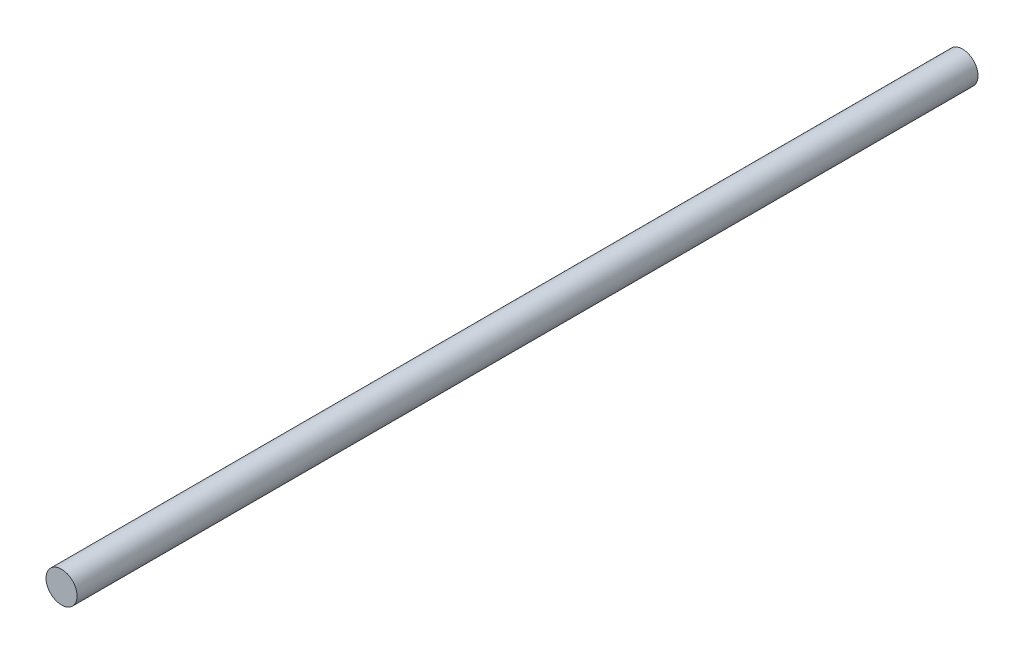
ISO-10303-21;
HEADER;
FILE_DESCRIPTION(('STEP AP214'),'2;1');
FILE_NAME('part.step','',(''),(''),'','','');
FILE_SCHEMA(('AUTOMOTIVE_DESIGN { 1 0 10303 214 1 1 1 1 }'));
ENDSEC;
DATA;
#1=APPLICATION_CONTEXT('core data for automotive mechanical design processes');
#2=APPLICATION_PROTOCOL_DEFINITION('international standard','automotive_design',2000,#1);
#3=PRODUCT_CONTEXT('',#1,'mechanical');
#4=PRODUCT('Part','Part','',(#3));
#5=PRODUCT_RELATED_PRODUCT_CATEGORY('part','',(#4));
#6=PRODUCT_DEFINITION_FORMATION('','',#4);
#7=PRODUCT_DEFINITION_CONTEXT('part definition',#1,'design');
#8=PRODUCT_DEFINITION('design','',#6,#7);
#9=PRODUCT_DEFINITION_SHAPE('','',#8);
#10=(LENGTH_UNIT() NAMED_UNIT(*) SI_UNIT(.MILLI.,.METRE.));
#11=(NAMED_UNIT(*) PLANE_ANGLE_UNIT() SI_UNIT($,.RADIAN.));
#12=(NAMED_UNIT(*) SI_UNIT($,.STERADIAN.) SOLID_ANGLE_UNIT());
#13=UNCERTAINTY_MEASURE_WITH_UNIT(LENGTH_MEASURE(1.E-05),#10,'distance_accuracy_value','');
#14=(GEOMETRIC_REPRESENTATION_CONTEXT(3) GLOBAL_UNCERTAINTY_ASSIGNED_CONTEXT((#13)) GLOBAL_UNIT_ASSIGNED_CONTEXT((#10,
#11,#12)) REPRESENTATION_CONTEXT('',''));
#15=CARTESIAN_POINT('',(0.,0.,0.));
#16=DIRECTION('',(0.,0.,1.));
#17=DIRECTION('',(1.,0.,0.));
#18=AXIS2_PLACEMENT_3D('',#15,#16,#17);
#19=CARTESIAN_POINT('',(0.,0.,58.));
#20=DIRECTION('',(0.,0.,-1.));
#21=DIRECTION('',(-1.,0.,0.));
#22=AXIS2_PLACEMENT_3D('',#19,#20,#21);
#23=CYLINDRICAL_SURFACE('',#22,1.);
#24=CARTESIAN_POINT('',(0.,0.,58.));
#25=DIRECTION('',(0.,0.,1.));
#26=DIRECTION('',(1.,0.,0.));
#27=AXIS2_PLACEMENT_3D('',#24,#25,#26);
#28=CIRCLE('',#27,1.);
#29=CARTESIAN_POINT('',(-1.,0.,58.));
#30=VERTEX_POINT('',#29);
#31=EDGE_CURVE('E10',#30,#30,#28,.T.);
#32=CARTESIAN_POINT('',(0.,0.,0.));
#33=DIRECTION('',(0.,0.,1.));
#34=DIRECTION('',(1.,0.,0.));
#35=AXIS2_PLACEMENT_3D('',#32,#33,#34);
#36=CIRCLE('',#35,1.);
#37=CARTESIAN_POINT('',(-1.,0.,0.));
#38=VERTEX_POINT('',#37);
#39=EDGE_CURVE('E34',#38,#38,#36,.T.);
#40=CARTESIAN_POINT('',(-1.,0.,58.));
#41=CARTESIAN_POINT('',(-1.,0.,57.3958333333333));
#42=CARTESIAN_POINT('',(-1.,0.,56.7916666666667));
#43=CARTESIAN_POINT('',(-1.,0.,55.5833333333333));
#44=CARTESIAN_POINT('',(-1.,0.,54.9791666666667));
#45=CARTESIAN_POINT('',(-1.,0.,53.7708333333333));
#46=CARTESIAN_POINT('',(-1.,0.,53.1666666666667));
#47=CARTESIAN_POINT('',(-1.,0.,51.9583333333333));
#48=CARTESIAN_POINT('',(-1.,0.,51.3541666666667));
#49=CARTESIAN_POINT('',(-1.,0.,50.1458333333333));
#50=CARTESIAN_POINT('',(-1.,0.,49.5416666666667));
#51=CARTESIAN_POINT('',(-1.,0.,48.3333333333333));
#52=CARTESIAN_POINT('',(-1.,0.,47.7291666666667));
#53=CARTESIAN_POINT('',(-1.,0.,46.5208333333333));
#54=CARTESIAN_POINT('',(-1.,0.,45.9166666666667));
#55=CARTESIAN_POINT('',(-1.,0.,44.7083333333333));
#56=CARTESIAN_POINT('',(-1.,0.,44.1041666666667));
#57=CARTESIAN_POINT('',(-1.,0.,42.8958333333333));
#58=CARTESIAN_POINT('',(-1.,0.,42.2916666666667));
#59=CARTESIAN_POINT('',(-1.,0.,41.0833333333333));
#60=CARTESIAN_POINT('',(-1.,0.,40.4791666666667));
#61=CARTESIAN_POINT('',(-1.,0.,39.2708333333333));
#62=CARTESIAN_POINT('',(-1.,0.,38.6666666666667));
#63=CARTESIAN_POINT('',(-1.,0.,37.4583333333333));
#64=CARTESIAN_POINT('',(-1.,0.,36.8541666666667));
#65=CARTESIAN_POINT('',(-1.,0.,35.6458333333333));
#66=CARTESIAN_POINT('',(-1.,0.,35.0416666666667));
#67=CARTESIAN_POINT('',(-1.,0.,33.8333333333333));
#68=CARTESIAN_POINT('',(-1.,0.,33.2291666666667));
#69=CARTESIAN_POINT('',(-1.,0.,32.0208333333333));
#70=CARTESIAN_POINT('',(-1.,0.,31.4166666666667));
#71=CARTESIAN_POINT('',(-1.,0.,30.2083333333333));
#72=CARTESIAN_POINT('',(-1.,0.,29.6041666666667));
#73=CARTESIAN_POINT('',(-1.,0.,28.3958333333333));
#74=CARTESIAN_POINT('',(-1.,0.,27.7916666666667));
#75=CARTESIAN_POINT('',(-1.,0.,26.5833333333333));
#76=CARTESIAN_POINT('',(-1.,0.,25.9791666666667));
#77=CARTESIAN_POINT('',(-1.,0.,24.7708333333333));
#78=CARTESIAN_POINT('',(-1.,0.,24.1666666666667));
#79=CARTESIAN_POINT('',(-1.,0.,22.9583333333333));
#80=CARTESIAN_POINT('',(-1.,0.,22.3541666666667));
#81=CARTESIAN_POINT('',(-1.,0.,21.1458333333333));
#82=CARTESIAN_POINT('',(-1.,0.,20.5416666666667));
#83=CARTESIAN_POINT('',(-1.,0.,19.3333333333333));
#84=CARTESIAN_POINT('',(-1.,0.,18.7291666666667));
#85=CARTESIAN_POINT('',(-1.,0.,17.5208333333333));
#86=CARTESIAN_POINT('',(-1.,0.,16.9166666666667));
#87=CARTESIAN_POINT('',(-1.,0.,15.7083333333333));
#88=CARTESIAN_POINT('',(-1.,0.,15.1041666666667));
#89=CARTESIAN_POINT('',(-1.,0.,13.8958333333333));
#90=CARTESIAN_POINT('',(-1.,0.,13.2916666666667));
#91=CARTESIAN_POINT('',(-1.,0.,12.0833333333333));
#92=CARTESIAN_POINT('',(-1.,0.,11.4791666666667));
#93=CARTESIAN_POINT('',(-1.,0.,10.2708333333333));
#94=CARTESIAN_POINT('',(-1.,0.,9.66666666666667));
#95=CARTESIAN_POINT('',(-1.,0.,8.45833333333333));
#96=CARTESIAN_POINT('',(-1.,0.,7.85416666666667));
#97=CARTESIAN_POINT('',(-1.,0.,6.64583333333333));
#98=CARTESIAN_POINT('',(-1.,0.,6.04166666666667));
#99=CARTESIAN_POINT('',(-1.,0.,4.83333333333333));
#100=CARTESIAN_POINT('',(-1.,0.,4.22916666666667));
#101=CARTESIAN_POINT('',(-1.,0.,3.02083333333334));
#102=CARTESIAN_POINT('',(-1.,0.,2.41666666666667));
#103=CARTESIAN_POINT('',(-1.,0.,1.20833333333333));
#104=CARTESIAN_POINT('',(-1.,0.,0.604166666666666));
#105=CARTESIAN_POINT('',(-1.,0.,0.));
#106=B_SPLINE_CURVE_WITH_KNOTS('',3,(#40,#41,#42,#43,#44,#45,#46,#47,#48,#49,#50,#51,#52,#53,
#54,#55,#56,#57,#58,#59,#60,#61,#62,#63,#64,#65,#66,#67,#68,#69,#70,#71,#72,#73,#74,#75,#76,#77,
#78,#79,#80,#81,#82,#83,#84,#85,#86,#87,#88,#89,#90,#91,#92,#93,#94,#95,#96,#97,#98,#99,#100,
#101,#102,#103,#104,#105),.UNSPECIFIED.,.F.,.F.,(4,2,2,2,2,2,2,2,2,2,2,2,2,2,2,2,2,2,2,2,2,2,2,
2,2,2,2,2,2,2,2,2,4),(0.,1.8125,3.625,5.4375,7.25000000000001,9.0625,10.875,12.6875,14.5,
16.3125,18.125,19.9375,21.75,23.5625,25.375,27.1875,29.,30.8125,32.625,34.4375,36.25,38.0625,
39.875,41.6875,43.5,45.3125,47.125,48.9375,50.75,52.5625,54.375,56.1875,58.),.UNSPECIFIED.);
#107=EDGE_CURVE('BSEAM31',#30,#38,#106,.T.);
#108=ORIENTED_EDGE('',*,*,#31,.F.);
#109=ORIENTED_EDGE('',*,*,#39,.T.);
#110=ORIENTED_EDGE('',*,*,#107,.T.);
#111=ORIENTED_EDGE('',*,*,#107,.F.);
#112=EDGE_LOOP('',(#108,#110,#109,#111));
#113=FACE_BOUND('',#112,.T.);
#114=ADVANCED_FACE('F31',(#113),#23,.T.);
#115=CARTESIAN_POINT('',(0.,0.,58.));
#116=DIRECTION('',(0.,0.,1.));
#117=DIRECTION('',(1.,0.,0.));
#118=AXIS2_PLACEMENT_3D('',#115,#116,#117);
#119=PLANE('',#118);
#120=ORIENTED_EDGE('',*,*,#31,.T.);
#121=EDGE_LOOP('',(#120));
#122=FACE_BOUND('',#121,.T.);
#123=ADVANCED_FACE('F46',(#122),#119,.T.);
#124=CARTESIAN_POINT('',(0.,0.,0.));
#125=DIRECTION('',(0.,0.,1.));
#126=DIRECTION('',(1.,0.,0.));
#127=AXIS2_PLACEMENT_3D('',#124,#125,#126);
#128=PLANE('',#127);
#129=ORIENTED_EDGE('',*,*,#39,.F.);
#130=EDGE_LOOP('',(#129));
#131=FACE_BOUND('',#130,.T.);
#132=ADVANCED_FACE('F44',(#131),#128,.F.);
#133=CLOSED_SHELL('',(#114,#123,#132));
#134=MANIFOLD_SOLID_BREP('B2',#133);
#135=ADVANCED_BREP_SHAPE_REPRESENTATION('',(#18,#134),#14);
#136=SHAPE_DEFINITION_REPRESENTATION(#9,#135);
ENDSEC;
END-ISO-10303-21;
